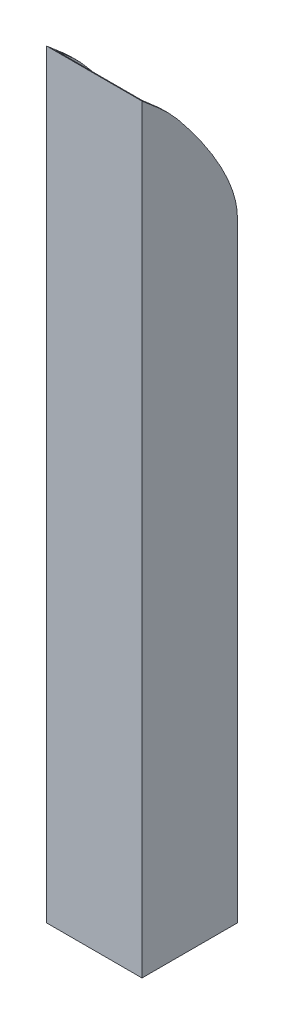
ISO-10303-21;
HEADER;
FILE_DESCRIPTION(('STEP AP214'),'2;1');
FILE_NAME('part.step','',(''),(''),'','','');
FILE_SCHEMA(('AUTOMOTIVE_DESIGN { 1 0 10303 214 1 1 1 1 }'));
ENDSEC;
DATA;
#1=APPLICATION_CONTEXT('core data for automotive mechanical design processes');
#2=APPLICATION_PROTOCOL_DEFINITION('international standard','automotive_design',2000,#1);
#3=PRODUCT_CONTEXT('',#1,'mechanical');
#4=PRODUCT('Part','Part','',(#3));
#5=PRODUCT_RELATED_PRODUCT_CATEGORY('part','',(#4));
#6=PRODUCT_DEFINITION_FORMATION('','',#4);
#7=PRODUCT_DEFINITION_CONTEXT('part definition',#1,'design');
#8=PRODUCT_DEFINITION('design','',#6,#7);
#9=PRODUCT_DEFINITION_SHAPE('','',#8);
#10=(LENGTH_UNIT() NAMED_UNIT(*) SI_UNIT(.MILLI.,.METRE.));
#11=(NAMED_UNIT(*) PLANE_ANGLE_UNIT() SI_UNIT($,.RADIAN.));
#12=(NAMED_UNIT(*) SI_UNIT($,.STERADIAN.) SOLID_ANGLE_UNIT());
#13=UNCERTAINTY_MEASURE_WITH_UNIT(LENGTH_MEASURE(1.E-05),#10,'distance_accuracy_value','');
#14=(GEOMETRIC_REPRESENTATION_CONTEXT(3) GLOBAL_UNCERTAINTY_ASSIGNED_CONTEXT((#13)) GLOBAL_UNIT_ASSIGNED_CONTEXT((#10,
#11,#12)) REPRESENTATION_CONTEXT('',''));
#15=CARTESIAN_POINT('',(0.,0.,0.));
#16=DIRECTION('',(0.,0.,1.));
#17=DIRECTION('',(1.,0.,0.));
#18=AXIS2_PLACEMENT_3D('',#15,#16,#17);
#19=CARTESIAN_POINT('',(0.,0.,0.));
#20=DIRECTION('',(0.,-1.,0.));
#21=DIRECTION('',(0.,0.,-1.));
#22=AXIS2_PLACEMENT_3D('',#19,#20,#21);
#23=PLANE('',#22);
#24=DIRECTION('',(0.,0.,-1.));
#25=VECTOR('',#24,1.);
#26=CARTESIAN_POINT('',(12.7,0.,12.7));
#27=LINE('',#26,#25);
#28=CARTESIAN_POINT('',(12.7,0.,12.7));
#29=VERTEX_POINT('',#28);
#30=CARTESIAN_POINT('',(12.7,0.,-12.7));
#31=VERTEX_POINT('',#30);
#32=EDGE_CURVE('E126',#29,#31,#27,.T.);
#33=ORIENTED_EDGE('',*,*,#32,.F.);
#34=DIRECTION('',(1.,0.,0.));
#35=VECTOR('',#34,1.);
#36=CARTESIAN_POINT('',(-12.7,0.,12.7));
#37=LINE('',#36,#35);
#38=CARTESIAN_POINT('',(-12.7,0.,12.7));
#39=VERTEX_POINT('',#38);
#40=EDGE_CURVE('E120',#39,#29,#37,.T.);
#41=ORIENTED_EDGE('',*,*,#40,.F.);
#42=DIRECTION('',(0.,0.,1.));
#43=VECTOR('',#42,1.);
#44=CARTESIAN_POINT('',(-12.7,0.,12.7));
#45=LINE('',#44,#43);
#46=CARTESIAN_POINT('',(-12.7,0.,-12.7));
#47=VERTEX_POINT('',#46);
#48=EDGE_CURVE('E123',#47,#39,#45,.T.);
#49=ORIENTED_EDGE('',*,*,#48,.F.);
#50=DIRECTION('',(-1.,0.,0.));
#51=VECTOR('',#50,1.);
#52=CARTESIAN_POINT('',(-12.7,0.,-12.7));
#53=LINE('',#52,#51);
#54=EDGE_CURVE('E113',#31,#47,#53,.T.);
#55=ORIENTED_EDGE('',*,*,#54,.F.);
#56=EDGE_LOOP('',(#33,#41,#49,#55));
#57=FACE_BOUND('',#56,.T.);
#58=DIRECTION('',(-1.,0.,0.));
#59=VECTOR('',#58,1.);
#60=CARTESIAN_POINT('',(-11.4554,0.,-11.4554));
#61=LINE('',#60,#59);
#62=CARTESIAN_POINT('',(11.4554,0.,-11.4554));
#63=VERTEX_POINT('',#62);
#64=CARTESIAN_POINT('',(-11.4554,0.,-11.4554));
#65=VERTEX_POINT('',#64);
#66=EDGE_CURVE('E137',#63,#65,#61,.T.);
#67=ORIENTED_EDGE('',*,*,#66,.T.);
#68=DIRECTION('',(0.,0.,1.));
#69=VECTOR('',#68,1.);
#70=CARTESIAN_POINT('',(-11.4554,0.,11.4554));
#71=LINE('',#70,#69);
#72=CARTESIAN_POINT('',(-11.4554,0.,11.4554));
#73=VERTEX_POINT('',#72);
#74=EDGE_CURVE('E146',#65,#73,#71,.T.);
#75=ORIENTED_EDGE('',*,*,#74,.T.);
#76=DIRECTION('',(1.,0.,0.));
#77=VECTOR('',#76,1.);
#78=CARTESIAN_POINT('',(-11.4554,0.,11.4554));
#79=LINE('',#78,#77);
#80=CARTESIAN_POINT('',(11.4554,0.,11.4554));
#81=VERTEX_POINT('',#80);
#82=EDGE_CURVE('E143',#73,#81,#79,.T.);
#83=ORIENTED_EDGE('',*,*,#82,.T.);
#84=DIRECTION('',(0.,0.,-1.));
#85=VECTOR('',#84,1.);
#86=CARTESIAN_POINT('',(11.4554,0.,11.4554));
#87=LINE('',#86,#85);
#88=EDGE_CURVE('E140',#81,#63,#87,.T.);
#89=ORIENTED_EDGE('',*,*,#88,.T.);
#90=EDGE_LOOP('',(#67,#75,#83,#89));
#91=FACE_BOUND('',#90,.T.);
#92=ADVANCED_FACE('F32',(#57,#91),#23,.T.);
#93=CARTESIAN_POINT('',(12.7,254.,12.7));
#94=DIRECTION('',(-1.,0.,0.));
#95=DIRECTION('',(0.,0.,1.));
#96=AXIS2_PLACEMENT_3D('',#93,#94,#95);
#97=PLANE('',#96);
#98=DIRECTION('',(0.,-1.,0.));
#99=VECTOR('',#98,1.);
#100=CARTESIAN_POINT('',(12.7,254.,-12.7));
#101=LINE('',#100,#99);
#102=CARTESIAN_POINT('',(12.7,162.56,-12.7));
#103=VERTEX_POINT('',#102);
#104=EDGE_CURVE('E40',#103,#31,#101,.T.);
#105=ORIENTED_EDGE('',*,*,#104,.F.);
#106=CARTESIAN_POINT('',(12.7,258.068818761448,68.2764073776735));
#107=CARTESIAN_POINT('',(12.7,191.724871957064,6.81916874334744));
#108=CARTESIAN_POINT('',(12.7,210.439854492741,14.0369631426112));
#109=CARTESIAN_POINT('',(12.7,171.26313825066,-12.7));
#110=CARTESIAN_POINT('',(12.7,162.56,-12.7));
#111=B_SPLINE_CURVE_WITH_KNOTS('',3,(#106,#107,#108,#109,#110),.UNSPECIFIED.,.F.,.F.,(4,1,4),
(0.,0.708572366704816,1.),.UNSPECIFIED.);
#112=CARTESIAN_POINT('',(12.7,202.183999997634,12.6999999972382));
#113=VERTEX_POINT('',#112);
#114=EDGE_CURVE('E97',#113,#103,#111,.T.);
#115=ORIENTED_EDGE('',*,*,#114,.F.);
#116=DIRECTION('',(0.,-1.,0.));
#117=VECTOR('',#116,1.);
#118=CARTESIAN_POINT('',(12.7,254.,12.7));
#119=LINE('',#118,#117);
#120=EDGE_CURVE('E116',#113,#29,#119,.T.);
#121=ORIENTED_EDGE('',*,*,#120,.T.);
#122=ORIENTED_EDGE('',*,*,#32,.T.);
#123=EDGE_LOOP('',(#105,#115,#121,#122));
#124=FACE_BOUND('',#123,.T.);
#125=ADVANCED_FACE('F34',(#124),#97,.F.);
#126=CARTESIAN_POINT('',(-12.7,254.,-12.7));
#127=DIRECTION('',(0.,0.,1.));
#128=DIRECTION('',(1.,0.,0.));
#129=AXIS2_PLACEMENT_3D('',#126,#127,#128);
#130=PLANE('',#129);
#131=DIRECTION('',(0.,-1.,0.));
#132=VECTOR('',#131,1.);
#133=CARTESIAN_POINT('',(-12.7,254.,-12.7));
#134=LINE('',#133,#132);
#135=CARTESIAN_POINT('',(-12.7,162.56,-12.7));
#136=VERTEX_POINT('',#135);
#137=EDGE_CURVE('E107',#136,#47,#134,.T.);
#138=ORIENTED_EDGE('',*,*,#137,.F.);
#139=DIRECTION('',(1.,0.,0.));
#140=VECTOR('',#139,1.);
#141=CARTESIAN_POINT('',(-12.7,162.56,-12.7));
#142=LINE('',#141,#140);
#143=EDGE_CURVE('E94',#136,#103,#142,.T.);
#144=ORIENTED_EDGE('',*,*,#143,.T.);
#145=ORIENTED_EDGE('',*,*,#104,.T.);
#146=ORIENTED_EDGE('',*,*,#54,.T.);
#147=EDGE_LOOP('',(#138,#144,#145,#146));
#148=FACE_BOUND('',#147,.T.);
#149=ADVANCED_FACE('F111',(#148),#130,.F.);
#150=CARTESIAN_POINT('',(-12.7,254.,12.7));
#151=DIRECTION('',(1.,0.,0.));
#152=DIRECTION('',(0.,0.,-1.));
#153=AXIS2_PLACEMENT_3D('',#150,#151,#152);
#154=PLANE('',#153);
#155=DIRECTION('',(0.,-1.,0.));
#156=VECTOR('',#155,1.);
#157=CARTESIAN_POINT('',(-12.7,254.,12.7));
#158=LINE('',#157,#156);
#159=CARTESIAN_POINT('',(-12.7,202.183999997634,12.7));
#160=VERTEX_POINT('',#159);
#161=EDGE_CURVE('E109',#160,#39,#158,.T.);
#162=ORIENTED_EDGE('',*,*,#161,.F.);
#163=CARTESIAN_POINT('',(-12.7,258.068818761448,68.2764073776735));
#164=CARTESIAN_POINT('',(-12.7,191.724871957064,6.81916874334744));
#165=CARTESIAN_POINT('',(-12.7,210.439854492741,14.0369631426112));
#166=CARTESIAN_POINT('',(-12.7,171.26313825066,-12.7));
#167=CARTESIAN_POINT('',(-12.7,162.56,-12.7));
#168=B_SPLINE_CURVE_WITH_KNOTS('',3,(#163,#164,#165,#166,#167),.UNSPECIFIED.,.F.,.F.,(4,1,4),
(0.,0.708572366704816,1.),.UNSPECIFIED.);
#169=EDGE_CURVE('E47',#160,#136,#168,.T.);
#170=ORIENTED_EDGE('',*,*,#169,.T.);
#171=ORIENTED_EDGE('',*,*,#137,.T.);
#172=ORIENTED_EDGE('',*,*,#48,.T.);
#173=EDGE_LOOP('',(#162,#170,#171,#172));
#174=FACE_BOUND('',#173,.T.);
#175=ADVANCED_FACE('F105',(#174),#154,.F.);
#176=CARTESIAN_POINT('',(-12.7,254.,12.7));
#177=DIRECTION('',(0.,0.,-1.));
#178=DIRECTION('',(-1.,0.,0.));
#179=AXIS2_PLACEMENT_3D('',#176,#177,#178);
#180=PLANE('',#179);
#181=ORIENTED_EDGE('',*,*,#120,.F.);
#182=DIRECTION('',(1.,0.,0.));
#183=VECTOR('',#182,1.);
#184=CARTESIAN_POINT('',(-12.7,202.184,12.7));
#185=LINE('',#184,#183);
#186=EDGE_CURVE('E149',#113,#160,#185,.F.);
#187=ORIENTED_EDGE('',*,*,#186,.T.);
#188=ORIENTED_EDGE('',*,*,#161,.T.);
#189=ORIENTED_EDGE('',*,*,#40,.T.);
#190=EDGE_LOOP('',(#181,#187,#188,#189));
#191=FACE_BOUND('',#190,.T.);
#192=ADVANCED_FACE('F194',(#191),#180,.F.);
#193=CARTESIAN_POINT('',(-11.4554,254.,11.4554));
#194=DIRECTION('',(1.,0.,0.));
#195=DIRECTION('',(0.,0.,-1.));
#196=AXIS2_PLACEMENT_3D('',#193,#194,#195);
#197=PLANE('',#196);
#198=CARTESIAN_POINT('',(-11.4554,258.068818761448,68.2764073776735));
#199=CARTESIAN_POINT('',(-11.4554,191.724871957064,6.81916874334744));
#200=CARTESIAN_POINT('',(-11.4554,210.439854492741,14.0369631426112));
#201=CARTESIAN_POINT('',(-11.4554,171.26313825066,-12.7));
#202=CARTESIAN_POINT('',(-11.4554,162.56,-12.7));
#203=B_SPLINE_CURVE_WITH_KNOTS('',3,(#198,#199,#200,#201,#202),.UNSPECIFIED.,.F.,.F.,(4,1,4),
(0.,0.708572366704816,1.),.UNSPECIFIED.);
#204=CARTESIAN_POINT('',(-11.4554,201.121565367526,11.4554));
#205=VERTEX_POINT('',#204);
#206=CARTESIAN_POINT('',(-11.4554,169.328715512313,-11.4554));
#207=VERTEX_POINT('',#206);
#208=EDGE_CURVE('E54',#205,#207,#203,.T.);
#209=ORIENTED_EDGE('',*,*,#208,.F.);
#210=DIRECTION('',(0.,-1.,0.));
#211=VECTOR('',#210,1.);
#212=CARTESIAN_POINT('',(-11.4554,254.,11.4554));
#213=LINE('',#212,#211);
#214=EDGE_CURVE('E129',#205,#73,#213,.T.);
#215=ORIENTED_EDGE('',*,*,#214,.T.);
#216=ORIENTED_EDGE('',*,*,#74,.F.);
#217=DIRECTION('',(0.,-1.,0.));
#218=VECTOR('',#217,1.);
#219=CARTESIAN_POINT('',(-11.4554,254.,-11.4554));
#220=LINE('',#219,#218);
#221=EDGE_CURVE('E135',#207,#65,#220,.T.);
#222=ORIENTED_EDGE('',*,*,#221,.F.);
#223=EDGE_LOOP('',(#209,#215,#216,#222));
#224=FACE_BOUND('',#223,.T.);
#225=ADVANCED_FACE('F190',(#224),#197,.T.);
#226=CARTESIAN_POINT('',(-11.4554,254.,11.4554));
#227=DIRECTION('',(0.,0.,-1.));
#228=DIRECTION('',(-1.,0.,0.));
#229=AXIS2_PLACEMENT_3D('',#226,#227,#228);
#230=PLANE('',#229);
#231=DIRECTION('',(1.,0.,0.));
#232=VECTOR('',#231,1.);
#233=CARTESIAN_POINT('',(-12.7,201.121565367526,11.4554));
#234=LINE('',#233,#232);
#235=CARTESIAN_POINT('',(11.4554,201.121565362266,11.4553999938214));
#236=VERTEX_POINT('',#235);
#237=EDGE_CURVE('E154',#236,#205,#234,.F.);
#238=ORIENTED_EDGE('',*,*,#237,.F.);
#239=DIRECTION('',(0.,-1.,0.));
#240=VECTOR('',#239,1.);
#241=CARTESIAN_POINT('',(11.4554,254.,11.4554));
#242=LINE('',#241,#240);
#243=EDGE_CURVE('E131',#236,#81,#242,.T.);
#244=ORIENTED_EDGE('',*,*,#243,.T.);
#245=ORIENTED_EDGE('',*,*,#82,.F.);
#246=ORIENTED_EDGE('',*,*,#214,.F.);
#247=EDGE_LOOP('',(#238,#244,#245,#246));
#248=FACE_BOUND('',#247,.T.);
#249=ADVANCED_FACE('F186',(#248),#230,.T.);
#250=CARTESIAN_POINT('',(11.4554,254.,11.4554));
#251=DIRECTION('',(-1.,0.,0.));
#252=DIRECTION('',(0.,0.,1.));
#253=AXIS2_PLACEMENT_3D('',#250,#251,#252);
#254=PLANE('',#253);
#255=CARTESIAN_POINT('',(11.4554,258.068818761448,68.2764073776735));
#256=CARTESIAN_POINT('',(11.4554,191.724871957064,6.81916874334744));
#257=CARTESIAN_POINT('',(11.4554,210.439854492741,14.0369631426112));
#258=CARTESIAN_POINT('',(11.4554,171.26313825066,-12.7));
#259=CARTESIAN_POINT('',(11.4554,162.56,-12.7));
#260=B_SPLINE_CURVE_WITH_KNOTS('',3,(#255,#256,#257,#258,#259),.UNSPECIFIED.,.F.,.F.,(4,1,4),
(0.,0.708572366704816,1.),.UNSPECIFIED.);
#261=CARTESIAN_POINT('',(11.4554,169.328715512313,-11.4554));
#262=VERTEX_POINT('',#261);
#263=EDGE_CURVE('E101',#262,#236,#260,.F.);
#264=ORIENTED_EDGE('',*,*,#263,.F.);
#265=DIRECTION('',(0.,-1.,0.));
#266=VECTOR('',#265,1.);
#267=CARTESIAN_POINT('',(11.4554,254.,-11.4554));
#268=LINE('',#267,#266);
#269=EDGE_CURVE('E133',#262,#63,#268,.T.);
#270=ORIENTED_EDGE('',*,*,#269,.T.);
#271=ORIENTED_EDGE('',*,*,#88,.F.);
#272=ORIENTED_EDGE('',*,*,#243,.F.);
#273=EDGE_LOOP('',(#264,#270,#271,#272));
#274=FACE_BOUND('',#273,.T.);
#275=ADVANCED_FACE('F182',(#274),#254,.T.);
#276=CARTESIAN_POINT('',(-11.4554,254.,-11.4554));
#277=DIRECTION('',(0.,0.,1.));
#278=DIRECTION('',(1.,0.,0.));
#279=AXIS2_PLACEMENT_3D('',#276,#277,#278);
#280=PLANE('',#279);
#281=DIRECTION('',(1.,0.,0.));
#282=VECTOR('',#281,1.);
#283=CARTESIAN_POINT('',(-12.7,169.328715512313,-11.4554));
#284=LINE('',#283,#282);
#285=EDGE_CURVE('E11',#207,#262,#284,.T.);
#286=ORIENTED_EDGE('',*,*,#285,.F.);
#287=ORIENTED_EDGE('',*,*,#221,.T.);
#288=ORIENTED_EDGE('',*,*,#66,.F.);
#289=ORIENTED_EDGE('',*,*,#269,.F.);
#290=EDGE_LOOP('',(#286,#287,#288,#289));
#291=FACE_BOUND('',#290,.T.);
#292=ADVANCED_FACE('F179',(#291),#280,.T.);
#293=DIRECTION('',(1.,0.,0.));
#294=VECTOR('',#293,1.);
#295=SURFACE_OF_LINEAR_EXTRUSION('',#168,#294);
#296=ORIENTED_EDGE('',*,*,#208,.T.);
#297=ORIENTED_EDGE('',*,*,#285,.T.);
#298=ORIENTED_EDGE('',*,*,#263,.T.);
#299=ORIENTED_EDGE('',*,*,#237,.T.);
#300=EDGE_LOOP('',(#296,#297,#298,#299));
#301=FACE_BOUND('',#300,.T.);
#302=ORIENTED_EDGE('',*,*,#114,.T.);
#303=ORIENTED_EDGE('',*,*,#143,.F.);
#304=ORIENTED_EDGE('',*,*,#169,.F.);
#305=ORIENTED_EDGE('',*,*,#186,.F.);
#306=EDGE_LOOP('',(#302,#303,#304,#305));
#307=FACE_BOUND('',#306,.T.);
#308=ADVANCED_FACE('F95',(#301,#307),#295,.F.);
#309=CLOSED_SHELL('',(#92,#125,#149,#175,#192,#225,#249,#275,#292,#308));
#310=MANIFOLD_SOLID_BREP('B2',#309);
#311=ADVANCED_BREP_SHAPE_REPRESENTATION('',(#18,#310),#14);
#312=SHAPE_DEFINITION_REPRESENTATION(#9,#311);
ENDSEC;
END-ISO-10303-21;
